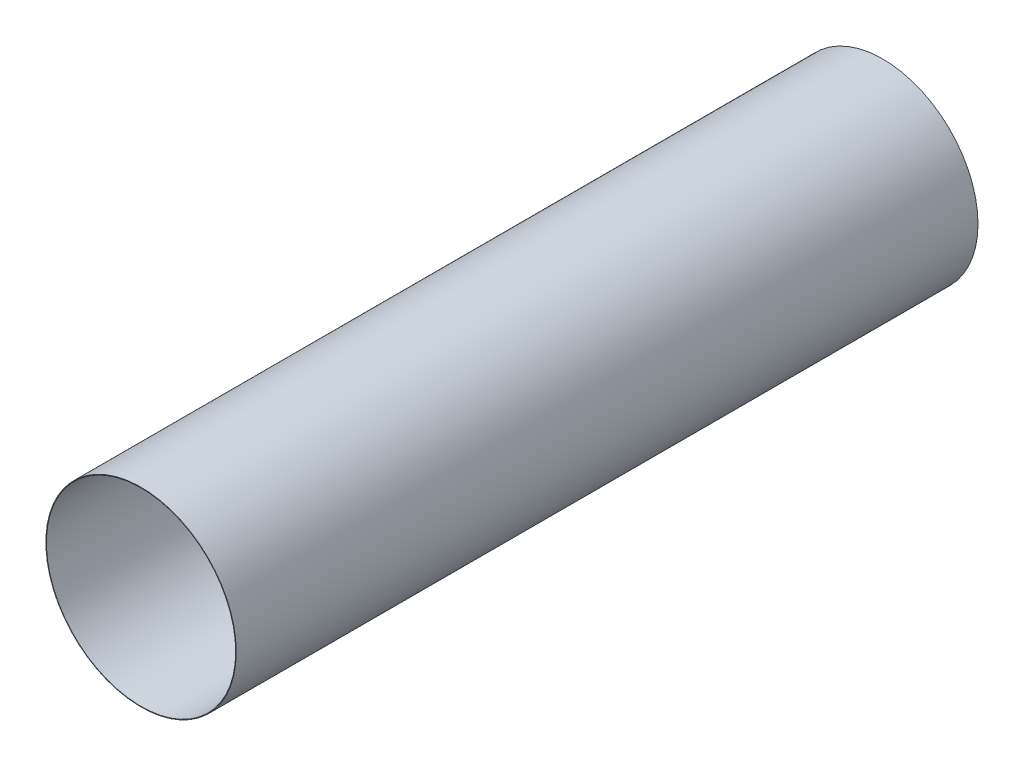
ISO-10303-21;
HEADER;
FILE_DESCRIPTION(('STEP AP214'),'2;1');
FILE_NAME('part.step','',(''),(''),'','','');
FILE_SCHEMA(('AUTOMOTIVE_DESIGN { 1 0 10303 214 1 1 1 1 }'));
ENDSEC;
DATA;
#1=APPLICATION_CONTEXT('core data for automotive mechanical design processes');
#2=APPLICATION_PROTOCOL_DEFINITION('international standard','automotive_design',2000,#1);
#3=PRODUCT_CONTEXT('',#1,'mechanical');
#4=PRODUCT('Part','Part','',(#3));
#5=PRODUCT_RELATED_PRODUCT_CATEGORY('part','',(#4));
#6=PRODUCT_DEFINITION_FORMATION('','',#4);
#7=PRODUCT_DEFINITION_CONTEXT('part definition',#1,'design');
#8=PRODUCT_DEFINITION('design','',#6,#7);
#9=PRODUCT_DEFINITION_SHAPE('','',#8);
#10=(LENGTH_UNIT() NAMED_UNIT(*) SI_UNIT(.MILLI.,.METRE.));
#11=(NAMED_UNIT(*) PLANE_ANGLE_UNIT() SI_UNIT($,.RADIAN.));
#12=(NAMED_UNIT(*) SI_UNIT($,.STERADIAN.) SOLID_ANGLE_UNIT());
#13=UNCERTAINTY_MEASURE_WITH_UNIT(LENGTH_MEASURE(1.E-05),#10,'distance_accuracy_value','');
#14=(GEOMETRIC_REPRESENTATION_CONTEXT(3) GLOBAL_UNCERTAINTY_ASSIGNED_CONTEXT((#13)) GLOBAL_UNIT_ASSIGNED_CONTEXT((#10,
#11,#12)) REPRESENTATION_CONTEXT('',''));
#15=CARTESIAN_POINT('',(0.,0.,0.));
#16=DIRECTION('',(0.,0.,1.));
#17=DIRECTION('',(1.,0.,0.));
#18=AXIS2_PLACEMENT_3D('',#15,#16,#17);
#19=CARTESIAN_POINT('',(0.,150.745087811132,590.55));
#20=DIRECTION('',(0.,0.,-1.));
#21=DIRECTION('',(-1.,0.,0.));
#22=AXIS2_PLACEMENT_3D('',#19,#20,#21);
#23=PLANE('',#22);
#24=CARTESIAN_POINT('',(0.,0.,590.55));
#25=DIRECTION('',(0.,0.,1.));
#26=DIRECTION('',(1.,0.,0.));
#27=AXIS2_PLACEMENT_3D('',#24,#25,#26);
#28=CIRCLE('',#27,150.745087811132);
#29=CARTESIAN_POINT('',(150.745087811132,0.,590.55));
#30=VERTEX_POINT('',#29);
#31=EDGE_CURVE('E49',#30,#30,#28,.T.);
#32=ORIENTED_EDGE('',*,*,#31,.F.);
#33=EDGE_LOOP('',(#32));
#34=FACE_BOUND('',#33,.T.);
#35=CARTESIAN_POINT('',(0.,0.,590.55));
#36=DIRECTION('',(0.,0.,1.));
#37=DIRECTION('',(1.,0.,0.));
#38=AXIS2_PLACEMENT_3D('',#35,#36,#37);
#39=CIRCLE('',#38,151.595087811132);
#40=CARTESIAN_POINT('',(151.595087811132,0.,590.55));
#41=VERTEX_POINT('',#40);
#42=EDGE_CURVE('E10',#41,#41,#39,.T.);
#43=ORIENTED_EDGE('',*,*,#42,.T.);
#44=EDGE_LOOP('',(#43));
#45=FACE_BOUND('',#44,.T.);
#46=ADVANCED_FACE('F38',(#34,#45),#23,.F.);
#47=CARTESIAN_POINT('',(0.,0.,754.38));
#48=DIRECTION('',(0.,0.,1.));
#49=DIRECTION('',(1.,0.,0.));
#50=AXIS2_PLACEMENT_3D('',#47,#48,#49);
#51=CYLINDRICAL_SURFACE('',#50,151.595087811132);
#52=ORIENTED_EDGE('',*,*,#42,.F.);
#53=EDGE_LOOP('',(#52));
#54=FACE_BOUND('',#53,.T.);
#55=CARTESIAN_POINT('',(0.,0.,-590.55));
#56=DIRECTION('',(0.,0.,1.));
#57=DIRECTION('',(1.,0.,0.));
#58=AXIS2_PLACEMENT_3D('',#55,#56,#57);
#59=CIRCLE('',#58,151.595087811132);
#60=CARTESIAN_POINT('',(151.595087811132,0.,-590.55));
#61=VERTEX_POINT('',#60);
#62=EDGE_CURVE('E45',#61,#61,#59,.T.);
#63=ORIENTED_EDGE('',*,*,#62,.T.);
#64=EDGE_LOOP('',(#63));
#65=FACE_BOUND('',#64,.T.);
#66=ADVANCED_FACE('F56',(#54,#65),#51,.T.);
#67=CARTESIAN_POINT('',(0.,150.745087811132,-590.55));
#68=DIRECTION('',(0.,0.,1.));
#69=DIRECTION('',(1.,0.,0.));
#70=AXIS2_PLACEMENT_3D('',#67,#68,#69);
#71=PLANE('',#70);
#72=ORIENTED_EDGE('',*,*,#62,.F.);
#73=EDGE_LOOP('',(#72));
#74=FACE_BOUND('',#73,.T.);
#75=CARTESIAN_POINT('',(0.,0.,-590.55));
#76=DIRECTION('',(0.,0.,1.));
#77=DIRECTION('',(1.,0.,0.));
#78=AXIS2_PLACEMENT_3D('',#75,#76,#77);
#79=CIRCLE('',#78,150.745087811132);
#80=CARTESIAN_POINT('',(150.745087811132,0.,-590.55));
#81=VERTEX_POINT('',#80);
#82=EDGE_CURVE('E46',#81,#81,#79,.T.);
#83=ORIENTED_EDGE('',*,*,#82,.T.);
#84=EDGE_LOOP('',(#83));
#85=FACE_BOUND('',#84,.T.);
#86=ADVANCED_FACE('F65',(#74,#85),#71,.F.);
#87=CARTESIAN_POINT('',(0.,0.,754.38));
#88=DIRECTION('',(0.,0.,1.));
#89=DIRECTION('',(1.,0.,0.));
#90=AXIS2_PLACEMENT_3D('',#87,#88,#89);
#91=CYLINDRICAL_SURFACE('',#90,150.745087811132);
#92=ORIENTED_EDGE('',*,*,#82,.F.);
#93=EDGE_LOOP('',(#92));
#94=FACE_BOUND('',#93,.T.);
#95=ORIENTED_EDGE('',*,*,#31,.T.);
#96=EDGE_LOOP('',(#95));
#97=FACE_BOUND('',#96,.T.);
#98=ADVANCED_FACE('F57',(#94,#97),#91,.F.);
#99=CLOSED_SHELL('',(#46,#66,#86,#98));
#100=MANIFOLD_SOLID_BREP('B2',#99);
#101=ADVANCED_BREP_SHAPE_REPRESENTATION('',(#18,#100),#14);
#102=SHAPE_DEFINITION_REPRESENTATION(#9,#101);
ENDSEC;
END-ISO-10303-21;
